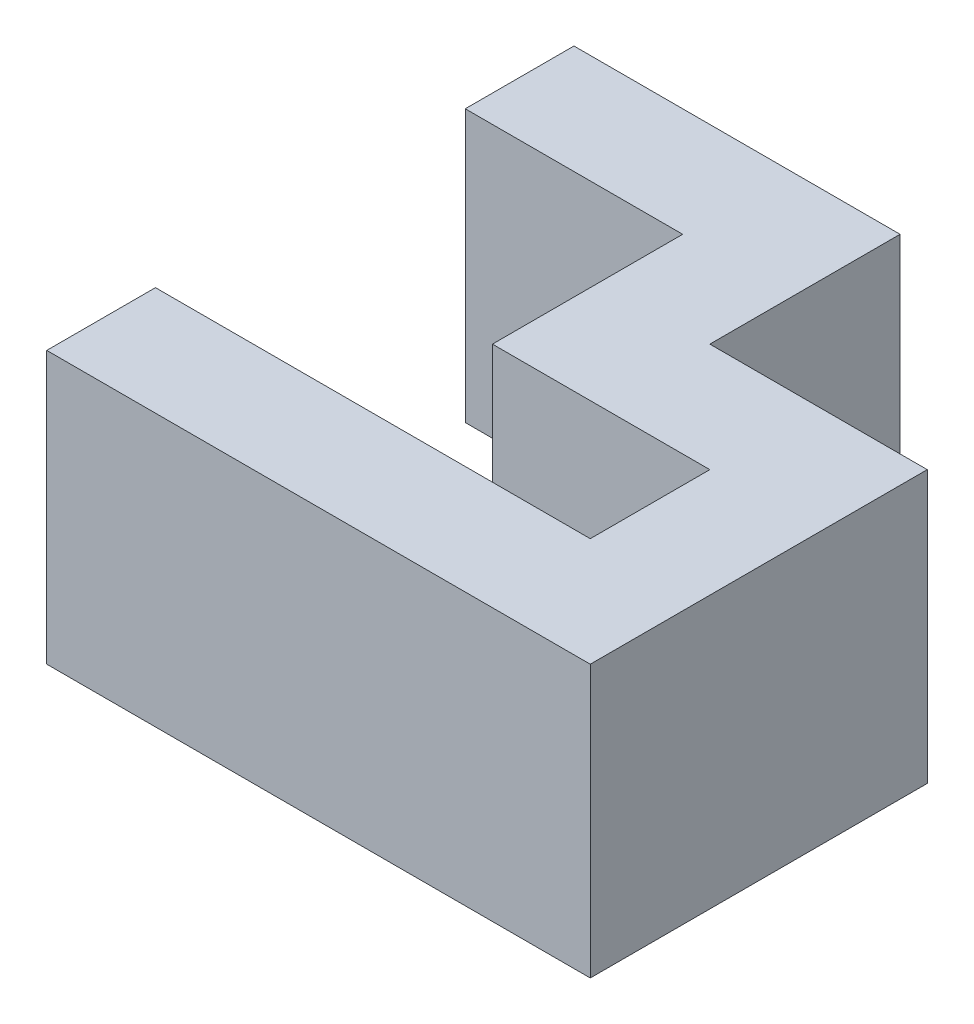
ISO-10303-21;
HEADER;
FILE_DESCRIPTION(('STEP AP214'),'2;1');
FILE_NAME('part.step','',(''),(''),'','','');
FILE_SCHEMA(('AUTOMOTIVE_DESIGN { 1 0 10303 214 1 1 1 1 }'));
ENDSEC;
DATA;
#1=APPLICATION_CONTEXT('core data for automotive mechanical design processes');
#2=APPLICATION_PROTOCOL_DEFINITION('international standard','automotive_design',2000,#1);
#3=PRODUCT_CONTEXT('',#1,'mechanical');
#4=PRODUCT('Part','Part','',(#3));
#5=PRODUCT_RELATED_PRODUCT_CATEGORY('part','',(#4));
#6=PRODUCT_DEFINITION_FORMATION('','',#4);
#7=PRODUCT_DEFINITION_CONTEXT('part definition',#1,'design');
#8=PRODUCT_DEFINITION('design','',#6,#7);
#9=PRODUCT_DEFINITION_SHAPE('','',#8);
#10=(LENGTH_UNIT() NAMED_UNIT(*) SI_UNIT(.MILLI.,.METRE.));
#11=(NAMED_UNIT(*) PLANE_ANGLE_UNIT() SI_UNIT($,.RADIAN.));
#12=(NAMED_UNIT(*) SI_UNIT($,.STERADIAN.) SOLID_ANGLE_UNIT());
#13=UNCERTAINTY_MEASURE_WITH_UNIT(LENGTH_MEASURE(1.E-05),#10,'distance_accuracy_value','');
#14=(GEOMETRIC_REPRESENTATION_CONTEXT(3) GLOBAL_UNCERTAINTY_ASSIGNED_CONTEXT((#13)) GLOBAL_UNIT_ASSIGNED_CONTEXT((#10,
#11,#12)) REPRESENTATION_CONTEXT('',''));
#15=CARTESIAN_POINT('',(0.,0.,0.));
#16=DIRECTION('',(0.,0.,1.));
#17=DIRECTION('',(1.,0.,0.));
#18=AXIS2_PLACEMENT_3D('',#15,#16,#17);
#19=CARTESIAN_POINT('',(0.,5.,-2.));
#20=DIRECTION('',(1.,0.,0.));
#21=DIRECTION('',(0.,0.,-1.));
#22=AXIS2_PLACEMENT_3D('',#19,#20,#21);
#23=PLANE('',#22);
#24=DIRECTION('',(0.,0.,1.));
#25=VECTOR('',#24,1.);
#26=CARTESIAN_POINT('',(0.,0.,-2.));
#27=LINE('',#26,#25);
#28=CARTESIAN_POINT('',(0.,0.,-2.));
#29=VERTEX_POINT('',#28);
#30=CARTESIAN_POINT('',(0.,0.,0.));
#31=VERTEX_POINT('',#30);
#32=EDGE_CURVE('E155',#29,#31,#27,.T.);
#33=ORIENTED_EDGE('',*,*,#32,.T.);
#34=DIRECTION('',(0.,-1.,0.));
#35=VECTOR('',#34,1.);
#36=CARTESIAN_POINT('',(0.,5.,0.));
#37=LINE('',#36,#35);
#38=CARTESIAN_POINT('',(0.,5.,0.));
#39=VERTEX_POINT('',#38);
#40=EDGE_CURVE('E11',#39,#31,#37,.T.);
#41=ORIENTED_EDGE('',*,*,#40,.F.);
#42=DIRECTION('',(0.,0.,1.));
#43=VECTOR('',#42,1.);
#44=CARTESIAN_POINT('',(0.,5.,-2.));
#45=LINE('',#44,#43);
#46=CARTESIAN_POINT('',(0.,5.,-2.));
#47=VERTEX_POINT('',#46);
#48=EDGE_CURVE('E177',#47,#39,#45,.T.);
#49=ORIENTED_EDGE('',*,*,#48,.F.);
#50=DIRECTION('',(0.,-1.,0.));
#51=VECTOR('',#50,1.);
#52=CARTESIAN_POINT('',(0.,5.,-2.));
#53=LINE('',#52,#51);
#54=EDGE_CURVE('E151',#47,#29,#53,.T.);
#55=ORIENTED_EDGE('',*,*,#54,.T.);
#56=EDGE_LOOP('',(#33,#41,#49,#55));
#57=FACE_BOUND('',#56,.T.);
#58=ADVANCED_FACE('F35',(#57),#23,.F.);
#59=CARTESIAN_POINT('',(0.,5.,0.));
#60=DIRECTION('',(0.,0.,-1.));
#61=DIRECTION('',(-1.,0.,0.));
#62=AXIS2_PLACEMENT_3D('',#59,#60,#61);
#63=PLANE('',#62);
#64=DIRECTION('',(1.,0.,0.));
#65=VECTOR('',#64,1.);
#66=CARTESIAN_POINT('',(0.,0.,0.));
#67=LINE('',#66,#65);
#68=CARTESIAN_POINT('',(10.,0.,0.));
#69=VERTEX_POINT('',#68);
#70=EDGE_CURVE('E158',#31,#69,#67,.T.);
#71=ORIENTED_EDGE('',*,*,#70,.T.);
#72=DIRECTION('',(0.,-1.,0.));
#73=VECTOR('',#72,1.);
#74=CARTESIAN_POINT('',(10.,5.,0.));
#75=LINE('',#74,#73);
#76=CARTESIAN_POINT('',(10.,5.,0.));
#77=VERTEX_POINT('',#76);
#78=EDGE_CURVE('E43',#77,#69,#75,.T.);
#79=ORIENTED_EDGE('',*,*,#78,.F.);
#80=DIRECTION('',(1.,0.,0.));
#81=VECTOR('',#80,1.);
#82=CARTESIAN_POINT('',(0.,5.,0.));
#83=LINE('',#82,#81);
#84=EDGE_CURVE('E106',#39,#77,#83,.T.);
#85=ORIENTED_EDGE('',*,*,#84,.F.);
#86=ORIENTED_EDGE('',*,*,#40,.T.);
#87=EDGE_LOOP('',(#71,#79,#85,#86));
#88=FACE_BOUND('',#87,.T.);
#89=ADVANCED_FACE('F255',(#88),#63,.F.);
#90=CARTESIAN_POINT('',(10.,5.,0.));
#91=DIRECTION('',(-1.,0.,0.));
#92=DIRECTION('',(0.,0.,1.));
#93=AXIS2_PLACEMENT_3D('',#90,#91,#92);
#94=PLANE('',#93);
#95=DIRECTION('',(0.,0.,-1.));
#96=VECTOR('',#95,1.);
#97=CARTESIAN_POINT('',(10.,0.,0.));
#98=LINE('',#97,#96);
#99=CARTESIAN_POINT('',(10.,0.,-6.2));
#100=VERTEX_POINT('',#99);
#101=EDGE_CURVE('E160',#69,#100,#98,.T.);
#102=ORIENTED_EDGE('',*,*,#101,.T.);
#103=DIRECTION('',(0.,-1.,0.));
#104=VECTOR('',#103,1.);
#105=CARTESIAN_POINT('',(10.,5.,-6.2));
#106=LINE('',#105,#104);
#107=CARTESIAN_POINT('',(10.,5.,-6.2));
#108=VERTEX_POINT('',#107);
#109=EDGE_CURVE('E196',#108,#100,#106,.T.);
#110=ORIENTED_EDGE('',*,*,#109,.F.);
#111=DIRECTION('',(0.,0.,-1.));
#112=VECTOR('',#111,1.);
#113=CARTESIAN_POINT('',(10.,5.,0.));
#114=LINE('',#113,#112);
#115=EDGE_CURVE('E204',#77,#108,#114,.T.);
#116=ORIENTED_EDGE('',*,*,#115,.F.);
#117=ORIENTED_EDGE('',*,*,#78,.T.);
#118=EDGE_LOOP('',(#102,#110,#116,#117));
#119=FACE_BOUND('',#118,.T.);
#120=ADVANCED_FACE('F202',(#119),#94,.F.);
#121=CARTESIAN_POINT('',(10.,5.,-6.2));
#122=DIRECTION('',(0.,0.,1.));
#123=DIRECTION('',(1.,0.,0.));
#124=AXIS2_PLACEMENT_3D('',#121,#122,#123);
#125=PLANE('',#124);
#126=DIRECTION('',(-1.,0.,0.));
#127=VECTOR('',#126,1.);
#128=CARTESIAN_POINT('',(10.,0.,-6.2));
#129=LINE('',#128,#127);
#130=CARTESIAN_POINT('',(6.,0.,-6.2));
#131=VERTEX_POINT('',#130);
#132=EDGE_CURVE('E162',#100,#131,#129,.T.);
#133=ORIENTED_EDGE('',*,*,#132,.T.);
#134=DIRECTION('',(0.,-1.,0.));
#135=VECTOR('',#134,1.);
#136=CARTESIAN_POINT('',(6.,5.,-6.2));
#137=LINE('',#136,#135);
#138=CARTESIAN_POINT('',(6.,5.,-6.2));
#139=VERTEX_POINT('',#138);
#140=EDGE_CURVE('E193',#139,#131,#137,.T.);
#141=ORIENTED_EDGE('',*,*,#140,.F.);
#142=DIRECTION('',(-1.,0.,0.));
#143=VECTOR('',#142,1.);
#144=CARTESIAN_POINT('',(10.,5.,-6.2));
#145=LINE('',#144,#143);
#146=EDGE_CURVE('E222',#108,#139,#145,.T.);
#147=ORIENTED_EDGE('',*,*,#146,.F.);
#148=ORIENTED_EDGE('',*,*,#109,.T.);
#149=EDGE_LOOP('',(#133,#141,#147,#148));
#150=FACE_BOUND('',#149,.T.);
#151=ADVANCED_FACE('F213',(#150),#125,.F.);
#152=CARTESIAN_POINT('',(6.,5.,-6.2));
#153=DIRECTION('',(-1.,0.,0.));
#154=DIRECTION('',(0.,0.,1.));
#155=AXIS2_PLACEMENT_3D('',#152,#153,#154);
#156=PLANE('',#155);
#157=DIRECTION('',(0.,0.,-1.));
#158=VECTOR('',#157,1.);
#159=CARTESIAN_POINT('',(6.,0.,-6.2));
#160=LINE('',#159,#158);
#161=CARTESIAN_POINT('',(6.,0.,-9.7));
#162=VERTEX_POINT('',#161);
#163=EDGE_CURVE('E164',#131,#162,#160,.T.);
#164=ORIENTED_EDGE('',*,*,#163,.T.);
#165=DIRECTION('',(0.,-1.,0.));
#166=VECTOR('',#165,1.);
#167=CARTESIAN_POINT('',(6.,5.,-9.7));
#168=LINE('',#167,#166);
#169=CARTESIAN_POINT('',(6.,5.,-9.7));
#170=VERTEX_POINT('',#169);
#171=EDGE_CURVE('E190',#170,#162,#168,.T.);
#172=ORIENTED_EDGE('',*,*,#171,.F.);
#173=DIRECTION('',(0.,0.,-1.));
#174=VECTOR('',#173,1.);
#175=CARTESIAN_POINT('',(6.,5.,-6.2));
#176=LINE('',#175,#174);
#177=EDGE_CURVE('E219',#139,#170,#176,.T.);
#178=ORIENTED_EDGE('',*,*,#177,.F.);
#179=ORIENTED_EDGE('',*,*,#140,.T.);
#180=EDGE_LOOP('',(#164,#172,#178,#179));
#181=FACE_BOUND('',#180,.T.);
#182=ADVANCED_FACE('F217',(#181),#156,.F.);
#183=CARTESIAN_POINT('',(6.,5.,-9.7));
#184=DIRECTION('',(0.,0.,1.));
#185=DIRECTION('',(1.,0.,0.));
#186=AXIS2_PLACEMENT_3D('',#183,#184,#185);
#187=PLANE('',#186);
#188=DIRECTION('',(-1.,0.,0.));
#189=VECTOR('',#188,1.);
#190=CARTESIAN_POINT('',(6.,0.,-9.7));
#191=LINE('',#190,#189);
#192=CARTESIAN_POINT('',(0.,0.,-9.7));
#193=VERTEX_POINT('',#192);
#194=EDGE_CURVE('E166',#162,#193,#191,.T.);
#195=ORIENTED_EDGE('',*,*,#194,.T.);
#196=DIRECTION('',(0.,-1.,0.));
#197=VECTOR('',#196,1.);
#198=CARTESIAN_POINT('',(0.,5.,-9.7));
#199=LINE('',#198,#197);
#200=CARTESIAN_POINT('',(0.,5.,-9.7));
#201=VERTEX_POINT('',#200);
#202=EDGE_CURVE('E187',#201,#193,#199,.T.);
#203=ORIENTED_EDGE('',*,*,#202,.F.);
#204=DIRECTION('',(-1.,0.,0.));
#205=VECTOR('',#204,1.);
#206=CARTESIAN_POINT('',(6.,5.,-9.7));
#207=LINE('',#206,#205);
#208=EDGE_CURVE('E221',#170,#201,#207,.T.);
#209=ORIENTED_EDGE('',*,*,#208,.F.);
#210=ORIENTED_EDGE('',*,*,#171,.T.);
#211=EDGE_LOOP('',(#195,#203,#209,#210));
#212=FACE_BOUND('',#211,.T.);
#213=ADVANCED_FACE('F268',(#212),#187,.F.);
#214=CARTESIAN_POINT('',(0.,5.,-9.7));
#215=DIRECTION('',(1.,0.,0.));
#216=DIRECTION('',(0.,0.,-1.));
#217=AXIS2_PLACEMENT_3D('',#214,#215,#216);
#218=PLANE('',#217);
#219=DIRECTION('',(0.,0.,1.));
#220=VECTOR('',#219,1.);
#221=CARTESIAN_POINT('',(0.,0.,-9.7));
#222=LINE('',#221,#220);
#223=CARTESIAN_POINT('',(0.,0.,-7.7));
#224=VERTEX_POINT('',#223);
#225=EDGE_CURVE('E168',#193,#224,#222,.T.);
#226=ORIENTED_EDGE('',*,*,#225,.T.);
#227=DIRECTION('',(0.,-1.,0.));
#228=VECTOR('',#227,1.);
#229=CARTESIAN_POINT('',(0.,5.,-7.7));
#230=LINE('',#229,#228);
#231=CARTESIAN_POINT('',(0.,5.,-7.7));
#232=VERTEX_POINT('',#231);
#233=EDGE_CURVE('E184',#232,#224,#230,.T.);
#234=ORIENTED_EDGE('',*,*,#233,.F.);
#235=DIRECTION('',(0.,0.,1.));
#236=VECTOR('',#235,1.);
#237=CARTESIAN_POINT('',(0.,5.,-9.7));
#238=LINE('',#237,#236);
#239=EDGE_CURVE('E224',#201,#232,#238,.T.);
#240=ORIENTED_EDGE('',*,*,#239,.F.);
#241=ORIENTED_EDGE('',*,*,#202,.T.);
#242=EDGE_LOOP('',(#226,#234,#240,#241));
#243=FACE_BOUND('',#242,.T.);
#244=ADVANCED_FACE('F271',(#243),#218,.F.);
#245=CARTESIAN_POINT('',(0.,5.,-7.7));
#246=DIRECTION('',(0.,0.,-1.));
#247=DIRECTION('',(-1.,0.,0.));
#248=AXIS2_PLACEMENT_3D('',#245,#246,#247);
#249=PLANE('',#248);
#250=DIRECTION('',(1.,0.,0.));
#251=VECTOR('',#250,1.);
#252=CARTESIAN_POINT('',(0.,0.,-7.7));
#253=LINE('',#252,#251);
#254=CARTESIAN_POINT('',(4.,0.,-7.7));
#255=VERTEX_POINT('',#254);
#256=EDGE_CURVE('E170',#224,#255,#253,.T.);
#257=ORIENTED_EDGE('',*,*,#256,.T.);
#258=DIRECTION('',(0.,-1.,0.));
#259=VECTOR('',#258,1.);
#260=CARTESIAN_POINT('',(4.,5.,-7.7));
#261=LINE('',#260,#259);
#262=CARTESIAN_POINT('',(4.,5.,-7.7));
#263=VERTEX_POINT('',#262);
#264=EDGE_CURVE('E181',#263,#255,#261,.T.);
#265=ORIENTED_EDGE('',*,*,#264,.F.);
#266=DIRECTION('',(1.,0.,0.));
#267=VECTOR('',#266,1.);
#268=CARTESIAN_POINT('',(0.,5.,-7.7));
#269=LINE('',#268,#267);
#270=EDGE_CURVE('E230',#232,#263,#269,.T.);
#271=ORIENTED_EDGE('',*,*,#270,.F.);
#272=ORIENTED_EDGE('',*,*,#233,.T.);
#273=EDGE_LOOP('',(#257,#265,#271,#272));
#274=FACE_BOUND('',#273,.T.);
#275=ADVANCED_FACE('F236',(#274),#249,.F.);
#276=CARTESIAN_POINT('',(4.,5.,-7.7));
#277=DIRECTION('',(1.,0.,0.));
#278=DIRECTION('',(0.,0.,-1.));
#279=AXIS2_PLACEMENT_3D('',#276,#277,#278);
#280=PLANE('',#279);
#281=DIRECTION('',(0.,0.,1.));
#282=VECTOR('',#281,1.);
#283=CARTESIAN_POINT('',(4.,0.,-7.7));
#284=LINE('',#283,#282);
#285=CARTESIAN_POINT('',(4.,0.,-4.2));
#286=VERTEX_POINT('',#285);
#287=EDGE_CURVE('E172',#255,#286,#284,.T.);
#288=ORIENTED_EDGE('',*,*,#287,.T.);
#289=DIRECTION('',(0.,-1.,0.));
#290=VECTOR('',#289,1.);
#291=CARTESIAN_POINT('',(4.,5.,-4.2));
#292=LINE('',#291,#290);
#293=CARTESIAN_POINT('',(4.,5.,-4.2));
#294=VERTEX_POINT('',#293);
#295=EDGE_CURVE('E146',#294,#286,#292,.T.);
#296=ORIENTED_EDGE('',*,*,#295,.F.);
#297=DIRECTION('',(0.,0.,1.));
#298=VECTOR('',#297,1.);
#299=CARTESIAN_POINT('',(4.,5.,-7.7));
#300=LINE('',#299,#298);
#301=EDGE_CURVE('E137',#263,#294,#300,.T.);
#302=ORIENTED_EDGE('',*,*,#301,.F.);
#303=ORIENTED_EDGE('',*,*,#264,.T.);
#304=EDGE_LOOP('',(#288,#296,#302,#303));
#305=FACE_BOUND('',#304,.T.);
#306=ADVANCED_FACE('F240',(#305),#280,.F.);
#307=CARTESIAN_POINT('',(4.,5.,-4.2));
#308=DIRECTION('',(0.,0.,-1.));
#309=DIRECTION('',(-1.,0.,0.));
#310=AXIS2_PLACEMENT_3D('',#307,#308,#309);
#311=PLANE('',#310);
#312=DIRECTION('',(1.,0.,0.));
#313=VECTOR('',#312,1.);
#314=CARTESIAN_POINT('',(4.,0.,-4.2));
#315=LINE('',#314,#313);
#316=CARTESIAN_POINT('',(8.,0.,-4.2));
#317=VERTEX_POINT('',#316);
#318=EDGE_CURVE('E145',#286,#317,#315,.T.);
#319=ORIENTED_EDGE('',*,*,#318,.T.);
#320=DIRECTION('',(0.,-1.,0.));
#321=VECTOR('',#320,1.);
#322=CARTESIAN_POINT('',(8.,5.,-4.2));
#323=LINE('',#322,#321);
#324=CARTESIAN_POINT('',(8.,5.,-4.2));
#325=VERTEX_POINT('',#324);
#326=EDGE_CURVE('E142',#325,#317,#323,.T.);
#327=ORIENTED_EDGE('',*,*,#326,.F.);
#328=DIRECTION('',(1.,0.,0.));
#329=VECTOR('',#328,1.);
#330=CARTESIAN_POINT('',(4.,5.,-4.2));
#331=LINE('',#330,#329);
#332=EDGE_CURVE('E131',#294,#325,#331,.T.);
#333=ORIENTED_EDGE('',*,*,#332,.F.);
#334=ORIENTED_EDGE('',*,*,#295,.T.);
#335=EDGE_LOOP('',(#319,#327,#333,#334));
#336=FACE_BOUND('',#335,.T.);
#337=ADVANCED_FACE('F143',(#336),#311,.F.);
#338=CARTESIAN_POINT('',(8.,5.,-4.2));
#339=DIRECTION('',(1.,0.,0.));
#340=DIRECTION('',(0.,0.,-1.));
#341=AXIS2_PLACEMENT_3D('',#338,#339,#340);
#342=PLANE('',#341);
#343=DIRECTION('',(0.,0.,1.));
#344=VECTOR('',#343,1.);
#345=CARTESIAN_POINT('',(8.,0.,-4.2));
#346=LINE('',#345,#344);
#347=CARTESIAN_POINT('',(8.,0.,-2.));
#348=VERTEX_POINT('',#347);
#349=EDGE_CURVE('E92',#317,#348,#346,.T.);
#350=ORIENTED_EDGE('',*,*,#349,.T.);
#351=DIRECTION('',(0.,-1.,0.));
#352=VECTOR('',#351,1.);
#353=CARTESIAN_POINT('',(8.,5.,-2.));
#354=LINE('',#353,#352);
#355=CARTESIAN_POINT('',(8.,5.,-2.));
#356=VERTEX_POINT('',#355);
#357=EDGE_CURVE('E147',#356,#348,#354,.T.);
#358=ORIENTED_EDGE('',*,*,#357,.F.);
#359=DIRECTION('',(0.,0.,1.));
#360=VECTOR('',#359,1.);
#361=CARTESIAN_POINT('',(8.,5.,-4.2));
#362=LINE('',#361,#360);
#363=EDGE_CURVE('E135',#325,#356,#362,.T.);
#364=ORIENTED_EDGE('',*,*,#363,.F.);
#365=ORIENTED_EDGE('',*,*,#326,.T.);
#366=EDGE_LOOP('',(#350,#358,#364,#365));
#367=FACE_BOUND('',#366,.T.);
#368=ADVANCED_FACE('F149',(#367),#342,.F.);
#369=CARTESIAN_POINT('',(8.,5.,-2.));
#370=DIRECTION('',(0.,0.,1.));
#371=DIRECTION('',(1.,0.,0.));
#372=AXIS2_PLACEMENT_3D('',#369,#370,#371);
#373=PLANE('',#372);
#374=DIRECTION('',(-1.,0.,0.));
#375=VECTOR('',#374,1.);
#376=CARTESIAN_POINT('',(8.,0.,-2.));
#377=LINE('',#376,#375);
#378=EDGE_CURVE('E98',#348,#29,#377,.T.);
#379=ORIENTED_EDGE('',*,*,#378,.T.);
#380=ORIENTED_EDGE('',*,*,#54,.F.);
#381=DIRECTION('',(-1.,0.,0.));
#382=VECTOR('',#381,1.);
#383=CARTESIAN_POINT('',(8.,5.,-2.));
#384=LINE('',#383,#382);
#385=EDGE_CURVE('E51',#356,#47,#384,.T.);
#386=ORIENTED_EDGE('',*,*,#385,.F.);
#387=ORIENTED_EDGE('',*,*,#357,.T.);
#388=EDGE_LOOP('',(#379,#380,#386,#387));
#389=FACE_BOUND('',#388,.T.);
#390=ADVANCED_FACE('F244',(#389),#373,.F.);
#391=CARTESIAN_POINT('',(0.,5.,0.));
#392=DIRECTION('',(0.,1.,0.));
#393=DIRECTION('',(0.,0.,1.));
#394=AXIS2_PLACEMENT_3D('',#391,#392,#393);
#395=PLANE('',#394);
#396=ORIENTED_EDGE('',*,*,#48,.T.);
#397=ORIENTED_EDGE('',*,*,#84,.T.);
#398=ORIENTED_EDGE('',*,*,#115,.T.);
#399=ORIENTED_EDGE('',*,*,#146,.T.);
#400=ORIENTED_EDGE('',*,*,#177,.T.);
#401=ORIENTED_EDGE('',*,*,#208,.T.);
#402=ORIENTED_EDGE('',*,*,#239,.T.);
#403=ORIENTED_EDGE('',*,*,#270,.T.);
#404=ORIENTED_EDGE('',*,*,#301,.T.);
#405=ORIENTED_EDGE('',*,*,#332,.T.);
#406=ORIENTED_EDGE('',*,*,#363,.T.);
#407=ORIENTED_EDGE('',*,*,#385,.T.);
#408=EDGE_LOOP('',(#396,#397,#398,#399,#400,#401,#402,#403,#404,#405,#406,#407));
#409=FACE_BOUND('',#408,.T.);
#410=ADVANCED_FACE('F133',(#409),#395,.T.);
#411=CARTESIAN_POINT('',(0.,0.,0.));
#412=DIRECTION('',(0.,1.,0.));
#413=DIRECTION('',(0.,0.,1.));
#414=AXIS2_PLACEMENT_3D('',#411,#412,#413);
#415=PLANE('',#414);
#416=ORIENTED_EDGE('',*,*,#32,.F.);
#417=ORIENTED_EDGE('',*,*,#378,.F.);
#418=ORIENTED_EDGE('',*,*,#349,.F.);
#419=ORIENTED_EDGE('',*,*,#318,.F.);
#420=ORIENTED_EDGE('',*,*,#287,.F.);
#421=ORIENTED_EDGE('',*,*,#256,.F.);
#422=ORIENTED_EDGE('',*,*,#225,.F.);
#423=ORIENTED_EDGE('',*,*,#194,.F.);
#424=ORIENTED_EDGE('',*,*,#163,.F.);
#425=ORIENTED_EDGE('',*,*,#132,.F.);
#426=ORIENTED_EDGE('',*,*,#101,.F.);
#427=ORIENTED_EDGE('',*,*,#70,.F.);
#428=EDGE_LOOP('',(#416,#417,#418,#419,#420,#421,#422,#423,#424,#425,#426,#427));
#429=FACE_BOUND('',#428,.T.);
#430=ADVANCED_FACE('F208',(#429),#415,.F.);
#431=CLOSED_SHELL('',(#58,#89,#120,#151,#182,#213,#244,#275,#306,#337,#368,#390,#410,#430));
#432=MANIFOLD_SOLID_BREP('B2',#431);
#433=ADVANCED_BREP_SHAPE_REPRESENTATION('',(#18,#432),#14);
#434=SHAPE_DEFINITION_REPRESENTATION(#9,#433);
ENDSEC;
END-ISO-10303-21;
